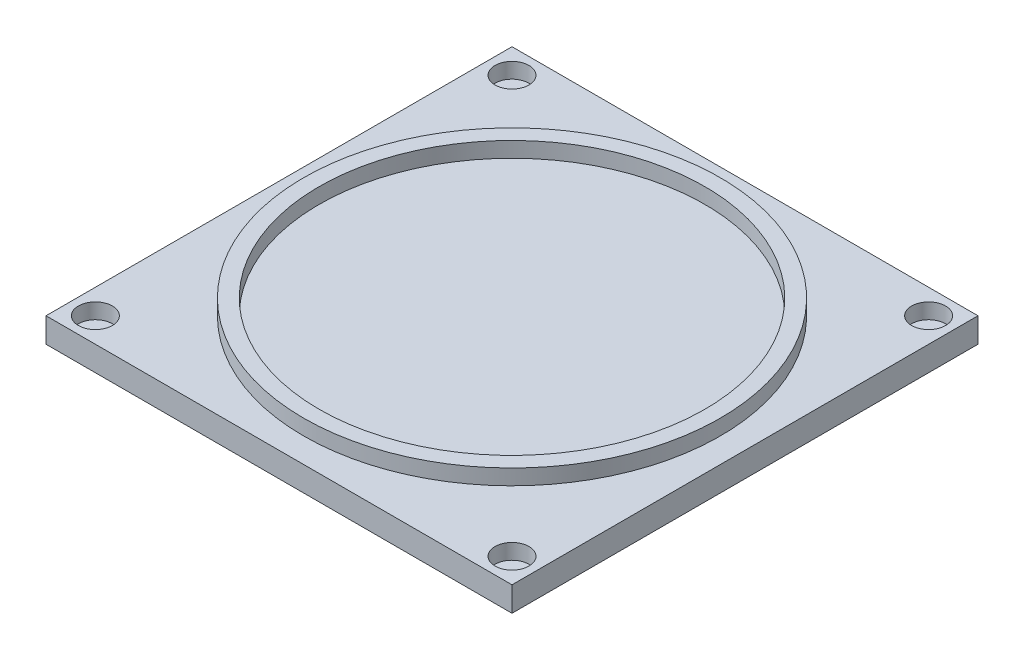
ISO-10303-21;
HEADER;
FILE_DESCRIPTION(('STEP AP214'),'2;1');
FILE_NAME('part.step','',(''),(''),'','','');
FILE_SCHEMA(('AUTOMOTIVE_DESIGN { 1 0 10303 214 1 1 1 1 }'));
ENDSEC;
DATA;
#1=APPLICATION_CONTEXT('core data for automotive mechanical design processes');
#2=APPLICATION_PROTOCOL_DEFINITION('international standard','automotive_design',2000,#1);
#3=PRODUCT_CONTEXT('',#1,'mechanical');
#4=PRODUCT('Part','Part','',(#3));
#5=PRODUCT_RELATED_PRODUCT_CATEGORY('part','',(#4));
#6=PRODUCT_DEFINITION_FORMATION('','',#4);
#7=PRODUCT_DEFINITION_CONTEXT('part definition',#1,'design');
#8=PRODUCT_DEFINITION('design','',#6,#7);
#9=PRODUCT_DEFINITION_SHAPE('','',#8);
#10=(LENGTH_UNIT() NAMED_UNIT(*) SI_UNIT(.MILLI.,.METRE.));
#11=(NAMED_UNIT(*) PLANE_ANGLE_UNIT() SI_UNIT($,.RADIAN.));
#12=(NAMED_UNIT(*) SI_UNIT($,.STERADIAN.) SOLID_ANGLE_UNIT());
#13=UNCERTAINTY_MEASURE_WITH_UNIT(LENGTH_MEASURE(1.E-05),#10,'distance_accuracy_value','');
#14=(GEOMETRIC_REPRESENTATION_CONTEXT(3) GLOBAL_UNCERTAINTY_ASSIGNED_CONTEXT((#13)) GLOBAL_UNIT_ASSIGNED_CONTEXT((#10,
#11,#12)) REPRESENTATION_CONTEXT('',''));
#15=CARTESIAN_POINT('',(0.,0.,0.));
#16=DIRECTION('',(0.,0.,1.));
#17=DIRECTION('',(1.,0.,0.));
#18=AXIS2_PLACEMENT_3D('',#15,#16,#17);
#19=CARTESIAN_POINT('',(-42.2989245674426,1.6,4.33904991658086));
#20=DIRECTION('',(1.,0.,0.));
#21=DIRECTION('',(0.,0.,-1.));
#22=AXIS2_PLACEMENT_3D('',#19,#20,#21);
#23=PLANE('',#22);
#24=DIRECTION('',(0.,0.,1.));
#25=VECTOR('',#24,1.);
#26=CARTESIAN_POINT('',(-42.2989245674426,0.,4.33904991658086));
#27=LINE('',#26,#25);
#28=CARTESIAN_POINT('',(-42.2989245674426,0.,4.33904991658086));
#29=VERTEX_POINT('',#28);
#30=CARTESIAN_POINT('',(-42.2989245674426,0.,34.5390499165809));
#31=VERTEX_POINT('',#30);
#32=EDGE_CURVE('E113',#29,#31,#27,.T.);
#33=ORIENTED_EDGE('',*,*,#32,.T.);
#34=DIRECTION('',(0.,-1.,0.));
#35=VECTOR('',#34,1.);
#36=CARTESIAN_POINT('',(-42.2989245674426,1.6,34.5390499165809));
#37=LINE('',#36,#35);
#38=CARTESIAN_POINT('',(-42.2989245674426,1.6,34.5390499165809));
#39=VERTEX_POINT('',#38);
#40=EDGE_CURVE('E51',#39,#31,#37,.T.);
#41=ORIENTED_EDGE('',*,*,#40,.F.);
#42=DIRECTION('',(0.,0.,1.));
#43=VECTOR('',#42,1.);
#44=CARTESIAN_POINT('',(-42.2989245674426,1.6,4.33904991658086));
#45=LINE('',#44,#43);
#46=CARTESIAN_POINT('',(-42.2989245674426,1.6,4.33904991658086));
#47=VERTEX_POINT('',#46);
#48=EDGE_CURVE('E95',#47,#39,#45,.T.);
#49=ORIENTED_EDGE('',*,*,#48,.F.);
#50=DIRECTION('',(0.,-1.,0.));
#51=VECTOR('',#50,1.);
#52=CARTESIAN_POINT('',(-42.2989245674426,1.6,4.33904991658086));
#53=LINE('',#52,#51);
#54=EDGE_CURVE('E109',#47,#29,#53,.T.);
#55=ORIENTED_EDGE('',*,*,#54,.T.);
#56=EDGE_LOOP('',(#33,#41,#49,#55));
#57=FACE_BOUND('',#56,.T.);
#58=ADVANCED_FACE('F42',(#57),#23,.F.);
#59=CARTESIAN_POINT('',(-42.2989245674426,1.6,34.5390499165809));
#60=DIRECTION('',(0.,0.,-1.));
#61=DIRECTION('',(-1.,0.,0.));
#62=AXIS2_PLACEMENT_3D('',#59,#60,#61);
#63=PLANE('',#62);
#64=DIRECTION('',(1.,0.,0.));
#65=VECTOR('',#64,1.);
#66=CARTESIAN_POINT('',(-42.2989245674426,0.,34.5390499165809));
#67=LINE('',#66,#65);
#68=CARTESIAN_POINT('',(-12.0989245674426,0.,34.5390499165809));
#69=VERTEX_POINT('',#68);
#70=EDGE_CURVE('E101',#31,#69,#67,.T.);
#71=ORIENTED_EDGE('',*,*,#70,.T.);
#72=DIRECTION('',(0.,-1.,0.));
#73=VECTOR('',#72,1.);
#74=CARTESIAN_POINT('',(-12.0989245674426,1.6,34.5390499165809));
#75=LINE('',#74,#73);
#76=CARTESIAN_POINT('',(-12.0989245674426,1.6,34.5390499165809));
#77=VERTEX_POINT('',#76);
#78=EDGE_CURVE('E99',#77,#69,#75,.T.);
#79=ORIENTED_EDGE('',*,*,#78,.F.);
#80=DIRECTION('',(1.,0.,0.));
#81=VECTOR('',#80,1.);
#82=CARTESIAN_POINT('',(-42.2989245674426,1.6,34.5390499165809));
#83=LINE('',#82,#81);
#84=EDGE_CURVE('E90',#39,#77,#83,.T.);
#85=ORIENTED_EDGE('',*,*,#84,.F.);
#86=ORIENTED_EDGE('',*,*,#40,.T.);
#87=EDGE_LOOP('',(#71,#79,#85,#86));
#88=FACE_BOUND('',#87,.T.);
#89=ADVANCED_FACE('F100',(#88),#63,.F.);
#90=CARTESIAN_POINT('',(-12.0989245674426,1.6,4.33904991658086));
#91=DIRECTION('',(-1.,0.,0.));
#92=DIRECTION('',(0.,0.,1.));
#93=AXIS2_PLACEMENT_3D('',#90,#91,#92);
#94=PLANE('',#93);
#95=DIRECTION('',(0.,0.,-1.));
#96=VECTOR('',#95,1.);
#97=CARTESIAN_POINT('',(-12.0989245674426,0.,4.33904991658086));
#98=LINE('',#97,#96);
#99=CARTESIAN_POINT('',(-12.0989245674426,0.,4.33904991658086));
#100=VERTEX_POINT('',#99);
#101=EDGE_CURVE('E76',#69,#100,#98,.T.);
#102=ORIENTED_EDGE('',*,*,#101,.T.);
#103=DIRECTION('',(0.,-1.,0.));
#104=VECTOR('',#103,1.);
#105=CARTESIAN_POINT('',(-12.0989245674426,1.6,4.33904991658086));
#106=LINE('',#105,#104);
#107=CARTESIAN_POINT('',(-12.0989245674426,1.6,4.33904991658086));
#108=VERTEX_POINT('',#107);
#109=EDGE_CURVE('E103',#108,#100,#106,.T.);
#110=ORIENTED_EDGE('',*,*,#109,.F.);
#111=DIRECTION('',(0.,0.,-1.));
#112=VECTOR('',#111,1.);
#113=CARTESIAN_POINT('',(-12.0989245674426,1.6,4.33904991658086));
#114=LINE('',#113,#112);
#115=EDGE_CURVE('E93',#77,#108,#114,.T.);
#116=ORIENTED_EDGE('',*,*,#115,.F.);
#117=ORIENTED_EDGE('',*,*,#78,.T.);
#118=EDGE_LOOP('',(#102,#110,#116,#117));
#119=FACE_BOUND('',#118,.T.);
#120=ADVANCED_FACE('F105',(#119),#94,.F.);
#121=CARTESIAN_POINT('',(-42.2989245674426,1.6,4.33904991658086));
#122=DIRECTION('',(0.,0.,1.));
#123=DIRECTION('',(1.,0.,0.));
#124=AXIS2_PLACEMENT_3D('',#121,#122,#123);
#125=PLANE('',#124);
#126=DIRECTION('',(-1.,0.,0.));
#127=VECTOR('',#126,1.);
#128=CARTESIAN_POINT('',(-42.2989245674426,0.,4.33904991658086));
#129=LINE('',#128,#127);
#130=EDGE_CURVE('E82',#100,#29,#129,.T.);
#131=ORIENTED_EDGE('',*,*,#130,.T.);
#132=ORIENTED_EDGE('',*,*,#54,.F.);
#133=DIRECTION('',(-1.,0.,0.));
#134=VECTOR('',#133,1.);
#135=CARTESIAN_POINT('',(-42.2989245674426,1.6,4.33904991658086));
#136=LINE('',#135,#134);
#137=EDGE_CURVE('E59',#108,#47,#136,.T.);
#138=ORIENTED_EDGE('',*,*,#137,.F.);
#139=ORIENTED_EDGE('',*,*,#109,.T.);
#140=EDGE_LOOP('',(#131,#132,#138,#139));
#141=FACE_BOUND('',#140,.T.);
#142=ADVANCED_FACE('F143',(#141),#125,.F.);
#143=CARTESIAN_POINT('',(0.,1.6,0.));
#144=DIRECTION('',(0.,1.,0.));
#145=DIRECTION('',(0.,0.,1.));
#146=AXIS2_PLACEMENT_3D('',#143,#144,#145);
#147=PLANE('',#146);
#148=CARTESIAN_POINT('',(-40.6989245674426,1.6,5.93904991658086));
#149=DIRECTION('',(0.,1.,0.));
#150=DIRECTION('',(0.,0.,1.));
#151=AXIS2_PLACEMENT_3D('',#148,#149,#150);
#152=CIRCLE('',#151,1.1);
#153=CARTESIAN_POINT('',(-40.6989245674426,1.6,7.03904991658086));
#154=VERTEX_POINT('',#153);
#155=EDGE_CURVE('E367',#154,#154,#152,.T.);
#156=ORIENTED_EDGE('',*,*,#155,.F.);
#157=EDGE_LOOP('',(#156));
#158=FACE_BOUND('',#157,.T.);
#159=CARTESIAN_POINT('',(-13.6989245674426,1.6,32.9390499165809));
#160=DIRECTION('',(0.,1.,0.));
#161=DIRECTION('',(0.,0.,1.));
#162=AXIS2_PLACEMENT_3D('',#159,#160,#161);
#163=CIRCLE('',#162,1.1);
#164=CARTESIAN_POINT('',(-13.6989245674426,1.6,34.0390499165809));
#165=VERTEX_POINT('',#164);
#166=EDGE_CURVE('E375',#165,#165,#163,.T.);
#167=ORIENTED_EDGE('',*,*,#166,.F.);
#168=EDGE_LOOP('',(#167));
#169=FACE_BOUND('',#168,.T.);
#170=CARTESIAN_POINT('',(-13.6989245674426,1.6,5.93904991658086));
#171=DIRECTION('',(0.,1.,0.));
#172=DIRECTION('',(0.,0.,1.));
#173=AXIS2_PLACEMENT_3D('',#170,#171,#172);
#174=CIRCLE('',#173,1.1);
#175=CARTESIAN_POINT('',(-13.6989245674426,1.6,7.03904991658086));
#176=VERTEX_POINT('',#175);
#177=EDGE_CURVE('E359',#176,#176,#174,.T.);
#178=ORIENTED_EDGE('',*,*,#177,.F.);
#179=EDGE_LOOP('',(#178));
#180=FACE_BOUND('',#179,.T.);
#181=CARTESIAN_POINT('',(-40.6989245674426,1.6,32.9390499165809));
#182=DIRECTION('',(0.,1.,0.));
#183=DIRECTION('',(0.,0.,1.));
#184=AXIS2_PLACEMENT_3D('',#181,#182,#183);
#185=CIRCLE('',#184,1.1);
#186=CARTESIAN_POINT('',(-40.6989245674426,1.6,34.0390499165809));
#187=VERTEX_POINT('',#186);
#188=EDGE_CURVE('E355',#187,#187,#185,.T.);
#189=ORIENTED_EDGE('',*,*,#188,.F.);
#190=EDGE_LOOP('',(#189));
#191=FACE_BOUND('',#190,.T.);
#192=CARTESIAN_POINT('',(-27.1989245674426,1.6,19.4390499165809));
#193=DIRECTION('',(0.,1.,0.));
#194=DIRECTION('',(0.,0.,1.));
#195=AXIS2_PLACEMENT_3D('',#192,#193,#194);
#196=CIRCLE('',#195,13.5);
#197=CARTESIAN_POINT('',(-27.1989245674426,1.6,32.9390499165809));
#198=VERTEX_POINT('',#197);
#199=EDGE_CURVE('E342',#198,#198,#196,.T.);
#200=ORIENTED_EDGE('',*,*,#199,.F.);
#201=EDGE_LOOP('',(#200));
#202=FACE_BOUND('',#201,.T.);
#203=ORIENTED_EDGE('',*,*,#48,.T.);
#204=ORIENTED_EDGE('',*,*,#84,.T.);
#205=ORIENTED_EDGE('',*,*,#115,.T.);
#206=ORIENTED_EDGE('',*,*,#137,.T.);
#207=EDGE_LOOP('',(#203,#204,#205,#206));
#208=FACE_BOUND('',#207,.T.);
#209=ADVANCED_FACE('F91',(#158,#169,#180,#191,#202,#208),#147,.T.);
#210=CARTESIAN_POINT('',(0.,0.,0.));
#211=DIRECTION('',(0.,1.,0.));
#212=DIRECTION('',(0.,0.,1.));
#213=AXIS2_PLACEMENT_3D('',#210,#211,#212);
#214=PLANE('',#213);
#215=ORIENTED_EDGE('',*,*,#32,.F.);
#216=ORIENTED_EDGE('',*,*,#130,.F.);
#217=ORIENTED_EDGE('',*,*,#101,.F.);
#218=ORIENTED_EDGE('',*,*,#70,.F.);
#219=EDGE_LOOP('',(#215,#216,#217,#218));
#220=FACE_BOUND('',#219,.T.);
#221=ADVANCED_FACE('F131',(#220),#214,.F.);
#222=CARTESIAN_POINT('',(-27.1989245674426,2.6,19.4390499165809));
#223=DIRECTION('',(0.,1.,0.));
#224=DIRECTION('',(0.,0.,1.));
#225=AXIS2_PLACEMENT_3D('',#222,#223,#224);
#226=PLANE('',#225);
#227=CARTESIAN_POINT('',(-27.1989245674426,2.6,19.4390499165809));
#228=DIRECTION('',(0.,1.,0.));
#229=DIRECTION('',(0.,0.,1.));
#230=AXIS2_PLACEMENT_3D('',#227,#228,#229);
#231=CIRCLE('',#230,13.5);
#232=CARTESIAN_POINT('',(-27.1989245674426,2.6,32.9390499165809));
#233=VERTEX_POINT('',#232);
#234=EDGE_CURVE('E117',#233,#233,#231,.T.);
#235=ORIENTED_EDGE('',*,*,#234,.T.);
#236=EDGE_LOOP('',(#235));
#237=FACE_BOUND('',#236,.T.);
#238=CARTESIAN_POINT('',(-27.1989245674426,2.6,19.4390499165809));
#239=DIRECTION('',(0.,1.,0.));
#240=DIRECTION('',(0.,0.,1.));
#241=AXIS2_PLACEMENT_3D('',#238,#239,#240);
#242=CIRCLE('',#241,12.5);
#243=CARTESIAN_POINT('',(-27.1989245674426,2.6,31.9390499165809));
#244=VERTEX_POINT('',#243);
#245=EDGE_CURVE('E345',#244,#244,#242,.T.);
#246=ORIENTED_EDGE('',*,*,#245,.F.);
#247=EDGE_LOOP('',(#246));
#248=FACE_BOUND('',#247,.T.);
#249=ADVANCED_FACE('F133',(#237,#248),#226,.T.);
#250=CARTESIAN_POINT('',(-27.1989245674426,2.6,19.4390499165809));
#251=DIRECTION('',(0.,-1.,0.));
#252=DIRECTION('',(0.,0.,-1.));
#253=AXIS2_PLACEMENT_3D('',#250,#251,#252);
#254=CYLINDRICAL_SURFACE('',#253,13.5);
#255=ORIENTED_EDGE('',*,*,#234,.F.);
#256=EDGE_LOOP('',(#255));
#257=FACE_BOUND('',#256,.T.);
#258=ORIENTED_EDGE('',*,*,#199,.T.);
#259=EDGE_LOOP('',(#258));
#260=FACE_BOUND('',#259,.T.);
#261=ADVANCED_FACE('F139',(#257,#260),#254,.T.);
#262=CARTESIAN_POINT('',(-27.1989245674426,2.6,19.4390499165809));
#263=DIRECTION('',(0.,-1.,0.));
#264=DIRECTION('',(0.,0.,-1.));
#265=AXIS2_PLACEMENT_3D('',#262,#263,#264);
#266=CYLINDRICAL_SURFACE('',#265,12.5);
#267=ORIENTED_EDGE('',*,*,#245,.T.);
#268=EDGE_LOOP('',(#267));
#269=FACE_BOUND('',#268,.T.);
#270=CARTESIAN_POINT('',(-27.1989245674426,1.6,19.4390499165809));
#271=DIRECTION('',(0.,1.,0.));
#272=DIRECTION('',(0.,0.,1.));
#273=AXIS2_PLACEMENT_3D('',#270,#271,#272);
#274=CIRCLE('',#273,12.5);
#275=CARTESIAN_POINT('',(-27.1989245674426,1.6,31.9390499165809));
#276=VERTEX_POINT('',#275);
#277=EDGE_CURVE('E11',#276,#276,#274,.F.);
#278=ORIENTED_EDGE('',*,*,#277,.T.);
#279=EDGE_LOOP('',(#278));
#280=FACE_BOUND('',#279,.T.);
#281=ADVANCED_FACE('F273',(#269,#280),#266,.F.);
#282=ORIENTED_EDGE('',*,*,#277,.F.);
#283=EDGE_LOOP('',(#282));
#284=FACE_BOUND('',#283,.T.);
#285=ADVANCED_FACE('F146',(#284),#147,.T.);
#286=CARTESIAN_POINT('',(-40.6989245674426,0.6,32.9390499165809));
#287=DIRECTION('',(0.,1.,0.));
#288=DIRECTION('',(0.,0.,1.));
#289=AXIS2_PLACEMENT_3D('',#286,#287,#288);
#290=CYLINDRICAL_SURFACE('',#289,1.1);
#291=CARTESIAN_POINT('',(-40.6989245674426,0.6,32.9390499165809));
#292=DIRECTION('',(0.,1.,0.));
#293=DIRECTION('',(0.,0.,1.));
#294=AXIS2_PLACEMENT_3D('',#291,#292,#293);
#295=CIRCLE('',#294,1.1);
#296=CARTESIAN_POINT('',(-40.6989245674426,0.6,34.0390499165809));
#297=VERTEX_POINT('',#296);
#298=EDGE_CURVE('E351',#297,#297,#295,.T.);
#299=ORIENTED_EDGE('',*,*,#298,.F.);
#300=EDGE_LOOP('',(#299));
#301=FACE_BOUND('',#300,.T.);
#302=ORIENTED_EDGE('',*,*,#188,.T.);
#303=EDGE_LOOP('',(#302));
#304=FACE_BOUND('',#303,.T.);
#305=ADVANCED_FACE('F176',(#301,#304),#290,.F.);
#306=CARTESIAN_POINT('',(-40.6989245674426,0.6,32.9390499165809));
#307=DIRECTION('',(0.,1.,0.));
#308=DIRECTION('',(0.,0.,1.));
#309=AXIS2_PLACEMENT_3D('',#306,#307,#308);
#310=PLANE('',#309);
#311=ORIENTED_EDGE('',*,*,#298,.T.);
#312=EDGE_LOOP('',(#311));
#313=FACE_BOUND('',#312,.T.);
#314=ADVANCED_FACE('F181',(#313),#310,.T.);
#315=CARTESIAN_POINT('',(-13.6989245674426,0.6,5.93904991658086));
#316=DIRECTION('',(0.,1.,0.));
#317=DIRECTION('',(0.,0.,1.));
#318=AXIS2_PLACEMENT_3D('',#315,#316,#317);
#319=CYLINDRICAL_SURFACE('',#318,1.1);
#320=CARTESIAN_POINT('',(-13.6989245674426,0.6,5.93904991658086));
#321=DIRECTION('',(0.,1.,0.));
#322=DIRECTION('',(0.,0.,1.));
#323=AXIS2_PLACEMENT_3D('',#320,#321,#322);
#324=CIRCLE('',#323,1.1);
#325=CARTESIAN_POINT('',(-13.6989245674426,0.6,7.03904991658086));
#326=VERTEX_POINT('',#325);
#327=EDGE_CURVE('E379',#326,#326,#324,.T.);
#328=ORIENTED_EDGE('',*,*,#327,.F.);
#329=EDGE_LOOP('',(#328));
#330=FACE_BOUND('',#329,.T.);
#331=ORIENTED_EDGE('',*,*,#177,.T.);
#332=EDGE_LOOP('',(#331));
#333=FACE_BOUND('',#332,.T.);
#334=ADVANCED_FACE('F193',(#330,#333),#319,.F.);
#335=CARTESIAN_POINT('',(-13.6989245674426,0.6,5.93904991658086));
#336=DIRECTION('',(0.,1.,0.));
#337=DIRECTION('',(0.,0.,1.));
#338=AXIS2_PLACEMENT_3D('',#335,#336,#337);
#339=PLANE('',#338);
#340=ORIENTED_EDGE('',*,*,#327,.T.);
#341=EDGE_LOOP('',(#340));
#342=FACE_BOUND('',#341,.T.);
#343=ADVANCED_FACE('F204',(#342),#339,.T.);
#344=CARTESIAN_POINT('',(-13.6989245674426,0.6,32.9390499165809));
#345=DIRECTION('',(0.,1.,0.));
#346=DIRECTION('',(0.,0.,1.));
#347=AXIS2_PLACEMENT_3D('',#344,#345,#346);
#348=CYLINDRICAL_SURFACE('',#347,1.1);
#349=CARTESIAN_POINT('',(-13.6989245674426,0.6,32.9390499165809));
#350=DIRECTION('',(0.,1.,0.));
#351=DIRECTION('',(0.,0.,1.));
#352=AXIS2_PLACEMENT_3D('',#349,#350,#351);
#353=CIRCLE('',#352,1.1);
#354=CARTESIAN_POINT('',(-13.6989245674426,0.6,34.0390499165809));
#355=VERTEX_POINT('',#354);
#356=EDGE_CURVE('E371',#355,#355,#353,.T.);
#357=ORIENTED_EDGE('',*,*,#356,.F.);
#358=EDGE_LOOP('',(#357));
#359=FACE_BOUND('',#358,.T.);
#360=ORIENTED_EDGE('',*,*,#166,.T.);
#361=EDGE_LOOP('',(#360));
#362=FACE_BOUND('',#361,.T.);
#363=ADVANCED_FACE('F215',(#359,#362),#348,.F.);
#364=CARTESIAN_POINT('',(-13.6989245674426,0.6,32.9390499165809));
#365=DIRECTION('',(0.,1.,0.));
#366=DIRECTION('',(0.,0.,1.));
#367=AXIS2_PLACEMENT_3D('',#364,#365,#366);
#368=PLANE('',#367);
#369=ORIENTED_EDGE('',*,*,#356,.T.);
#370=EDGE_LOOP('',(#369));
#371=FACE_BOUND('',#370,.T.);
#372=ADVANCED_FACE('F226',(#371),#368,.T.);
#373=CARTESIAN_POINT('',(-40.6989245674426,0.6,5.93904991658086));
#374=DIRECTION('',(0.,1.,0.));
#375=DIRECTION('',(0.,0.,1.));
#376=AXIS2_PLACEMENT_3D('',#373,#374,#375);
#377=CYLINDRICAL_SURFACE('',#376,1.1);
#378=CARTESIAN_POINT('',(-40.6989245674426,0.6,5.93904991658086));
#379=DIRECTION('',(0.,1.,0.));
#380=DIRECTION('',(0.,0.,1.));
#381=AXIS2_PLACEMENT_3D('',#378,#379,#380);
#382=CIRCLE('',#381,1.1);
#383=CARTESIAN_POINT('',(-40.6989245674426,0.6,7.03904991658086));
#384=VERTEX_POINT('',#383);
#385=EDGE_CURVE('E363',#384,#384,#382,.T.);
#386=ORIENTED_EDGE('',*,*,#385,.F.);
#387=EDGE_LOOP('',(#386));
#388=FACE_BOUND('',#387,.T.);
#389=ORIENTED_EDGE('',*,*,#155,.T.);
#390=EDGE_LOOP('',(#389));
#391=FACE_BOUND('',#390,.T.);
#392=ADVANCED_FACE('F237',(#388,#391),#377,.F.);
#393=CARTESIAN_POINT('',(-40.6989245674426,0.6,5.93904991658086));
#394=DIRECTION('',(0.,1.,0.));
#395=DIRECTION('',(0.,0.,1.));
#396=AXIS2_PLACEMENT_3D('',#393,#394,#395);
#397=PLANE('',#396);
#398=ORIENTED_EDGE('',*,*,#385,.T.);
#399=EDGE_LOOP('',(#398));
#400=FACE_BOUND('',#399,.T.);
#401=ADVANCED_FACE('F248',(#400),#397,.T.);
#402=CLOSED_SHELL('',(#58,#89,#120,#142,#209,#221,#249,#261,#281,#285,#305,#314,#334,#343,#363,
#372,#392,#401));
#403=MANIFOLD_SOLID_BREP('B2',#402);
#404=ADVANCED_BREP_SHAPE_REPRESENTATION('',(#18,#403),#14);
#405=SHAPE_DEFINITION_REPRESENTATION(#9,#404);
ENDSEC;
END-ISO-10303-21;
